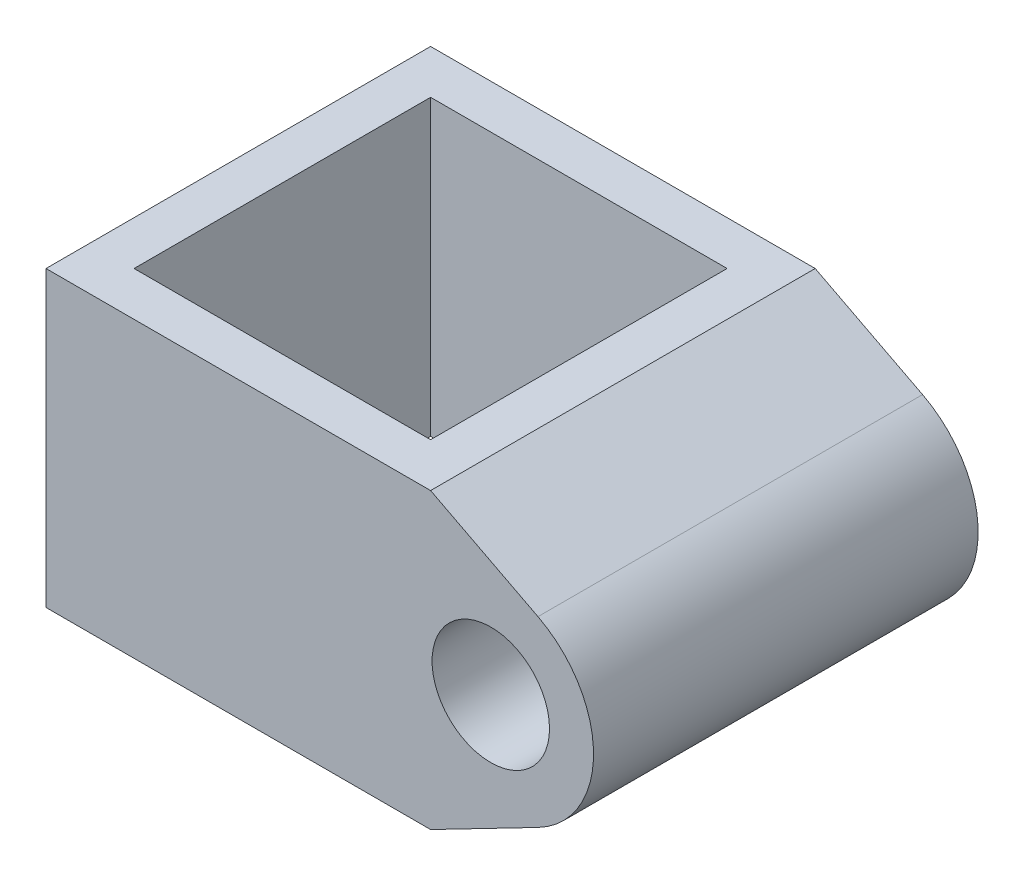
ISO-10303-21;
HEADER;
FILE_DESCRIPTION(('STEP AP214'),'2;1');
FILE_NAME('part.step','',(''),(''),'','','');
FILE_SCHEMA(('AUTOMOTIVE_DESIGN { 1 0 10303 214 1 1 1 1 }'));
ENDSEC;
DATA;
#1=APPLICATION_CONTEXT('core data for automotive mechanical design processes');
#2=APPLICATION_PROTOCOL_DEFINITION('international standard','automotive_design',2000,#1);
#3=PRODUCT_CONTEXT('',#1,'mechanical');
#4=PRODUCT('Part','Part','',(#3));
#5=PRODUCT_RELATED_PRODUCT_CATEGORY('part','',(#4));
#6=PRODUCT_DEFINITION_FORMATION('','',#4);
#7=PRODUCT_DEFINITION_CONTEXT('part definition',#1,'design');
#8=PRODUCT_DEFINITION('design','',#6,#7);
#9=PRODUCT_DEFINITION_SHAPE('','',#8);
#10=(LENGTH_UNIT() NAMED_UNIT(*) SI_UNIT(.MILLI.,.METRE.));
#11=(NAMED_UNIT(*) PLANE_ANGLE_UNIT() SI_UNIT($,.RADIAN.));
#12=(NAMED_UNIT(*) SI_UNIT($,.STERADIAN.) SOLID_ANGLE_UNIT());
#13=UNCERTAINTY_MEASURE_WITH_UNIT(LENGTH_MEASURE(1.E-05),#10,'distance_accuracy_value','');
#14=(GEOMETRIC_REPRESENTATION_CONTEXT(3) GLOBAL_UNCERTAINTY_ASSIGNED_CONTEXT((#13)) GLOBAL_UNIT_ASSIGNED_CONTEXT((#10,
#11,#12)) REPRESENTATION_CONTEXT('',''));
#15=CARTESIAN_POINT('',(0.,0.,0.));
#16=DIRECTION('',(0.,0.,1.));
#17=DIRECTION('',(1.,0.,0.));
#18=AXIS2_PLACEMENT_3D('',#15,#16,#17);
#19=CARTESIAN_POINT('',(0.,20.,0.));
#20=DIRECTION('',(0.,-1.,0.));
#21=DIRECTION('',(0.,0.,-1.));
#22=AXIS2_PLACEMENT_3D('',#19,#20,#21);
#23=PLANE('',#22);
#24=DIRECTION('',(0.,0.,1.));
#25=VECTOR('',#24,1.);
#26=CARTESIAN_POINT('',(-3.,20.,3.));
#27=LINE('',#26,#25);
#28=CARTESIAN_POINT('',(-3.,20.,-23.2));
#29=VERTEX_POINT('',#28);
#30=CARTESIAN_POINT('',(-3.,20.,3.));
#31=VERTEX_POINT('',#30);
#32=EDGE_CURVE('E209',#29,#31,#27,.T.);
#33=ORIENTED_EDGE('',*,*,#32,.T.);
#34=DIRECTION('',(1.,0.,0.));
#35=VECTOR('',#34,1.);
#36=CARTESIAN_POINT('',(-3.,20.,3.));
#37=LINE('',#36,#35);
#38=CARTESIAN_POINT('',(23.2,20.,3.));
#39=VERTEX_POINT('',#38);
#40=EDGE_CURVE('E213',#31,#39,#37,.T.);
#41=ORIENTED_EDGE('',*,*,#40,.T.);
#42=DIRECTION('',(0.,0.,-1.));
#43=VECTOR('',#42,1.);
#44=CARTESIAN_POINT('',(23.2,20.,3.));
#45=LINE('',#44,#43);
#46=CARTESIAN_POINT('',(23.2,20.,-23.2));
#47=VERTEX_POINT('',#46);
#48=EDGE_CURVE('E146',#39,#47,#45,.T.);
#49=ORIENTED_EDGE('',*,*,#48,.T.);
#50=DIRECTION('',(-1.,0.,0.));
#51=VECTOR('',#50,1.);
#52=CARTESIAN_POINT('',(-3.,20.,-23.2));
#53=LINE('',#52,#51);
#54=EDGE_CURVE('E219',#47,#29,#53,.T.);
#55=ORIENTED_EDGE('',*,*,#54,.T.);
#56=EDGE_LOOP('',(#33,#41,#49,#55));
#57=FACE_BOUND('',#56,.T.);
#58=DIRECTION('',(0.,0.,1.));
#59=VECTOR('',#58,1.);
#60=CARTESIAN_POINT('',(0.,20.,0.));
#61=LINE('',#60,#59);
#62=CARTESIAN_POINT('',(0.,20.,-20.2));
#63=VERTEX_POINT('',#62);
#64=CARTESIAN_POINT('',(0.,20.,0.));
#65=VERTEX_POINT('',#64);
#66=EDGE_CURVE('E170',#63,#65,#61,.T.);
#67=ORIENTED_EDGE('',*,*,#66,.F.);
#68=DIRECTION('',(-1.,0.,0.));
#69=VECTOR('',#68,1.);
#70=CARTESIAN_POINT('',(0.,20.,-20.2));
#71=LINE('',#70,#69);
#72=CARTESIAN_POINT('',(20.2,20.,-20.2));
#73=VERTEX_POINT('',#72);
#74=EDGE_CURVE('E180',#73,#63,#71,.T.);
#75=ORIENTED_EDGE('',*,*,#74,.F.);
#76=DIRECTION('',(0.,0.,-1.));
#77=VECTOR('',#76,1.);
#78=CARTESIAN_POINT('',(20.2,20.,0.));
#79=LINE('',#78,#77);
#80=CARTESIAN_POINT('',(20.2,20.,0.));
#81=VERTEX_POINT('',#80);
#82=EDGE_CURVE('E177',#81,#73,#79,.T.);
#83=ORIENTED_EDGE('',*,*,#82,.F.);
#84=DIRECTION('',(1.,0.,0.));
#85=VECTOR('',#84,1.);
#86=CARTESIAN_POINT('',(0.,20.,0.));
#87=LINE('',#86,#85);
#88=EDGE_CURVE('E173',#65,#81,#87,.T.);
#89=ORIENTED_EDGE('',*,*,#88,.F.);
#90=EDGE_LOOP('',(#67,#75,#83,#89));
#91=FACE_BOUND('',#90,.T.);
#92=ADVANCED_FACE('F47',(#57,#91),#23,.F.);
#93=CARTESIAN_POINT('',(0.,0.,0.));
#94=DIRECTION('',(0.,-1.,0.));
#95=DIRECTION('',(0.,0.,-1.));
#96=AXIS2_PLACEMENT_3D('',#93,#94,#95);
#97=PLANE('',#96);
#98=DIRECTION('',(0.,0.,1.));
#99=VECTOR('',#98,1.);
#100=CARTESIAN_POINT('',(-3.,0.,3.));
#101=LINE('',#100,#99);
#102=CARTESIAN_POINT('',(-3.,0.,-23.2));
#103=VERTEX_POINT('',#102);
#104=CARTESIAN_POINT('',(-3.,0.,3.));
#105=VERTEX_POINT('',#104);
#106=EDGE_CURVE('E208',#103,#105,#101,.T.);
#107=ORIENTED_EDGE('',*,*,#106,.F.);
#108=DIRECTION('',(-1.,0.,0.));
#109=VECTOR('',#108,1.);
#110=CARTESIAN_POINT('',(-3.,0.,-23.2));
#111=LINE('',#110,#109);
#112=CARTESIAN_POINT('',(23.2,0.,-23.2));
#113=VERTEX_POINT('',#112);
#114=EDGE_CURVE('E214',#113,#103,#111,.T.);
#115=ORIENTED_EDGE('',*,*,#114,.F.);
#116=DIRECTION('',(0.,0.,-1.));
#117=VECTOR('',#116,1.);
#118=CARTESIAN_POINT('',(23.2,0.,3.));
#119=LINE('',#118,#117);
#120=CARTESIAN_POINT('',(23.2,0.,3.));
#121=VERTEX_POINT('',#120);
#122=EDGE_CURVE('E228',#121,#113,#119,.T.);
#123=ORIENTED_EDGE('',*,*,#122,.F.);
#124=DIRECTION('',(1.,0.,0.));
#125=VECTOR('',#124,1.);
#126=CARTESIAN_POINT('',(-3.,0.,3.));
#127=LINE('',#126,#125);
#128=EDGE_CURVE('E225',#105,#121,#127,.T.);
#129=ORIENTED_EDGE('',*,*,#128,.F.);
#130=EDGE_LOOP('',(#107,#115,#123,#129));
#131=FACE_BOUND('',#130,.T.);
#132=DIRECTION('',(-1.,0.,0.));
#133=VECTOR('',#132,1.);
#134=CARTESIAN_POINT('',(0.,0.,-20.2));
#135=LINE('',#134,#133);
#136=CARTESIAN_POINT('',(20.2,0.,-20.2));
#137=VERTEX_POINT('',#136);
#138=CARTESIAN_POINT('',(0.,0.,-20.2));
#139=VERTEX_POINT('',#138);
#140=EDGE_CURVE('E174',#137,#139,#135,.T.);
#141=ORIENTED_EDGE('',*,*,#140,.T.);
#142=DIRECTION('',(0.,0.,1.));
#143=VECTOR('',#142,1.);
#144=CARTESIAN_POINT('',(0.,0.,0.));
#145=LINE('',#144,#143);
#146=CARTESIAN_POINT('',(0.,0.,0.));
#147=VERTEX_POINT('',#146);
#148=EDGE_CURVE('E71',#139,#147,#145,.T.);
#149=ORIENTED_EDGE('',*,*,#148,.T.);
#150=DIRECTION('',(1.,0.,0.));
#151=VECTOR('',#150,1.);
#152=CARTESIAN_POINT('',(0.,0.,0.));
#153=LINE('',#152,#151);
#154=CARTESIAN_POINT('',(20.2,0.,0.));
#155=VERTEX_POINT('',#154);
#156=EDGE_CURVE('E186',#147,#155,#153,.T.);
#157=ORIENTED_EDGE('',*,*,#156,.T.);
#158=DIRECTION('',(0.,0.,-1.));
#159=VECTOR('',#158,1.);
#160=CARTESIAN_POINT('',(20.2,0.,0.));
#161=LINE('',#160,#159);
#162=EDGE_CURVE('E191',#155,#137,#161,.T.);
#163=ORIENTED_EDGE('',*,*,#162,.T.);
#164=EDGE_LOOP('',(#141,#149,#157,#163));
#165=FACE_BOUND('',#164,.T.);
#166=ADVANCED_FACE('F243',(#131,#165),#97,.T.);
#167=CARTESIAN_POINT('',(-3.,20.,3.));
#168=DIRECTION('',(1.,0.,0.));
#169=DIRECTION('',(0.,0.,-1.));
#170=AXIS2_PLACEMENT_3D('',#167,#168,#169);
#171=PLANE('',#170);
#172=ORIENTED_EDGE('',*,*,#106,.T.);
#173=DIRECTION('',(0.,-1.,0.));
#174=VECTOR('',#173,1.);
#175=CARTESIAN_POINT('',(-3.,20.,3.));
#176=LINE('',#175,#174);
#177=EDGE_CURVE('E11',#31,#105,#176,.T.);
#178=ORIENTED_EDGE('',*,*,#177,.F.);
#179=ORIENTED_EDGE('',*,*,#32,.F.);
#180=DIRECTION('',(0.,-1.,0.));
#181=VECTOR('',#180,1.);
#182=CARTESIAN_POINT('',(-3.,20.,-23.2));
#183=LINE('',#182,#181);
#184=EDGE_CURVE('E56',#29,#103,#183,.T.);
#185=ORIENTED_EDGE('',*,*,#184,.T.);
#186=EDGE_LOOP('',(#172,#178,#179,#185));
#187=FACE_BOUND('',#186,.T.);
#188=ADVANCED_FACE('F49',(#187),#171,.F.);
#189=CARTESIAN_POINT('',(-3.,20.,3.));
#190=DIRECTION('',(0.,0.,-1.));
#191=DIRECTION('',(-1.,0.,0.));
#192=AXIS2_PLACEMENT_3D('',#189,#190,#191);
#193=PLANE('',#192);
#194=ORIENTED_EDGE('',*,*,#128,.T.);
#195=DIRECTION('',(0.888298940815905,0.459265709307087,0.));
#196=VECTOR('',#195,1.);
#197=CARTESIAN_POINT('',(4.89345980849192,-9.46479364062877,3.));
#198=LINE('',#197,#196);
#199=CARTESIAN_POINT('',(30.5148599651496,3.78190741428866,3.));
#200=VERTEX_POINT('',#199);
#201=EDGE_CURVE('E140',#121,#200,#198,.T.);
#202=ORIENTED_EDGE('',*,*,#201,.T.);
#203=CARTESIAN_POINT('',(27.3,10.,3.));
#204=DIRECTION('',(0.,0.,1.));
#205=DIRECTION('',(1.,0.,0.));
#206=AXIS2_PLACEMENT_3D('',#203,#204,#205);
#207=CIRCLE('',#206,7.00000000000001);
#208=CARTESIAN_POINT('',(30.5148599651496,16.2180925857113,3.));
#209=VERTEX_POINT('',#208);
#210=EDGE_CURVE('E133',#200,#209,#207,.T.);
#211=ORIENTED_EDGE('',*,*,#210,.T.);
#212=DIRECTION('',(0.888298940815905,-0.459265709307087,0.));
#213=VECTOR('',#212,1.);
#214=CARTESIAN_POINT('',(13.0527646711029,25.2462938057219,3.));
#215=LINE('',#214,#213);
#216=EDGE_CURVE('E144',#39,#209,#215,.T.);
#217=ORIENTED_EDGE('',*,*,#216,.F.);
#218=ORIENTED_EDGE('',*,*,#40,.F.);
#219=ORIENTED_EDGE('',*,*,#177,.T.);
#220=EDGE_LOOP('',(#194,#202,#211,#217,#218,#219));
#221=FACE_BOUND('',#220,.T.);
#222=CARTESIAN_POINT('',(27.3,10.,3.));
#223=DIRECTION('',(0.,0.,1.));
#224=DIRECTION('',(1.,0.,0.));
#225=AXIS2_PLACEMENT_3D('',#222,#223,#224);
#226=CIRCLE('',#225,4.00000000000001);
#227=CARTESIAN_POINT('',(31.3,10.,3.));
#228=VERTEX_POINT('',#227);
#229=EDGE_CURVE('E155',#228,#228,#226,.T.);
#230=ORIENTED_EDGE('',*,*,#229,.F.);
#231=EDGE_LOOP('',(#230));
#232=FACE_BOUND('',#231,.T.);
#233=ADVANCED_FACE('F151',(#221,#232),#193,.F.);
#234=CARTESIAN_POINT('',(-3.,20.,-23.2));
#235=DIRECTION('',(0.,0.,1.));
#236=DIRECTION('',(1.,0.,0.));
#237=AXIS2_PLACEMENT_3D('',#234,#235,#236);
#238=PLANE('',#237);
#239=ORIENTED_EDGE('',*,*,#114,.T.);
#240=ORIENTED_EDGE('',*,*,#184,.F.);
#241=ORIENTED_EDGE('',*,*,#54,.F.);
#242=DIRECTION('',(-0.888298940815905,0.459265709307087,0.));
#243=VECTOR('',#242,1.);
#244=CARTESIAN_POINT('',(13.0527646711029,25.2462938057219,-23.2));
#245=LINE('',#244,#243);
#246=CARTESIAN_POINT('',(30.5148599651496,16.2180925857113,-23.2));
#247=VERTEX_POINT('',#246);
#248=EDGE_CURVE('E165',#247,#47,#245,.T.);
#249=ORIENTED_EDGE('',*,*,#248,.F.);
#250=CARTESIAN_POINT('',(27.3,10.,-23.2));
#251=DIRECTION('',(0.,0.,1.));
#252=DIRECTION('',(1.,0.,0.));
#253=AXIS2_PLACEMENT_3D('',#250,#251,#252);
#254=CIRCLE('',#253,7.00000000000001);
#255=CARTESIAN_POINT('',(30.5148599651496,3.78190741428867,-23.2));
#256=VERTEX_POINT('',#255);
#257=EDGE_CURVE('E135',#247,#256,#254,.F.);
#258=ORIENTED_EDGE('',*,*,#257,.T.);
#259=DIRECTION('',(-0.888298940815905,-0.459265709307087,0.));
#260=VECTOR('',#259,1.);
#261=CARTESIAN_POINT('',(4.89345980849192,-9.46479364062877,-23.2));
#262=LINE('',#261,#260);
#263=EDGE_CURVE('E169',#256,#113,#262,.T.);
#264=ORIENTED_EDGE('',*,*,#263,.T.);
#265=EDGE_LOOP('',(#239,#240,#241,#249,#258,#264));
#266=FACE_BOUND('',#265,.T.);
#267=CARTESIAN_POINT('',(27.3,10.,-23.2));
#268=DIRECTION('',(0.,0.,1.));
#269=DIRECTION('',(1.,0.,0.));
#270=AXIS2_PLACEMENT_3D('',#267,#268,#269);
#271=CIRCLE('',#270,4.00000000000001);
#272=CARTESIAN_POINT('',(31.3,10.,-23.2));
#273=VERTEX_POINT('',#272);
#274=EDGE_CURVE('E187',#273,#273,#271,.F.);
#275=ORIENTED_EDGE('',*,*,#274,.F.);
#276=EDGE_LOOP('',(#275));
#277=FACE_BOUND('',#276,.T.);
#278=ADVANCED_FACE('F248',(#266,#277),#238,.F.);
#279=CARTESIAN_POINT('',(0.,20.,0.));
#280=DIRECTION('',(1.,0.,0.));
#281=DIRECTION('',(0.,0.,-1.));
#282=AXIS2_PLACEMENT_3D('',#279,#280,#281);
#283=PLANE('',#282);
#284=ORIENTED_EDGE('',*,*,#148,.F.);
#285=DIRECTION('',(0.,-1.,0.));
#286=VECTOR('',#285,1.);
#287=CARTESIAN_POINT('',(0.,20.,-20.2));
#288=LINE('',#287,#286);
#289=EDGE_CURVE('E183',#63,#139,#288,.T.);
#290=ORIENTED_EDGE('',*,*,#289,.F.);
#291=ORIENTED_EDGE('',*,*,#66,.T.);
#292=DIRECTION('',(0.,-1.,0.));
#293=VECTOR('',#292,1.);
#294=CARTESIAN_POINT('',(0.,20.,0.));
#295=LINE('',#294,#293);
#296=EDGE_CURVE('E205',#65,#147,#295,.T.);
#297=ORIENTED_EDGE('',*,*,#296,.T.);
#298=EDGE_LOOP('',(#284,#290,#291,#297));
#299=FACE_BOUND('',#298,.T.);
#300=ADVANCED_FACE('F264',(#299),#283,.T.);
#301=CARTESIAN_POINT('',(0.,20.,0.));
#302=DIRECTION('',(0.,0.,-1.));
#303=DIRECTION('',(-1.,0.,0.));
#304=AXIS2_PLACEMENT_3D('',#301,#302,#303);
#305=PLANE('',#304);
#306=ORIENTED_EDGE('',*,*,#156,.F.);
#307=ORIENTED_EDGE('',*,*,#296,.F.);
#308=ORIENTED_EDGE('',*,*,#88,.T.);
#309=DIRECTION('',(0.,-1.,0.));
#310=VECTOR('',#309,1.);
#311=CARTESIAN_POINT('',(20.2,20.,0.));
#312=LINE('',#311,#310);
#313=EDGE_CURVE('E202',#81,#155,#312,.T.);
#314=ORIENTED_EDGE('',*,*,#313,.T.);
#315=EDGE_LOOP('',(#306,#307,#308,#314));
#316=FACE_BOUND('',#315,.T.);
#317=ADVANCED_FACE('F271',(#316),#305,.T.);
#318=CARTESIAN_POINT('',(20.2,20.,0.));
#319=DIRECTION('',(-1.,0.,0.));
#320=DIRECTION('',(0.,0.,1.));
#321=AXIS2_PLACEMENT_3D('',#318,#319,#320);
#322=PLANE('',#321);
#323=ORIENTED_EDGE('',*,*,#162,.F.);
#324=ORIENTED_EDGE('',*,*,#313,.F.);
#325=ORIENTED_EDGE('',*,*,#82,.T.);
#326=DIRECTION('',(0.,-1.,0.));
#327=VECTOR('',#326,1.);
#328=CARTESIAN_POINT('',(20.2,20.,-20.2));
#329=LINE('',#328,#327);
#330=EDGE_CURVE('E63',#73,#137,#329,.T.);
#331=ORIENTED_EDGE('',*,*,#330,.T.);
#332=EDGE_LOOP('',(#323,#324,#325,#331));
#333=FACE_BOUND('',#332,.T.);
#334=ADVANCED_FACE('F283',(#333),#322,.T.);
#335=CARTESIAN_POINT('',(0.,20.,-20.2));
#336=DIRECTION('',(0.,0.,1.));
#337=DIRECTION('',(1.,0.,0.));
#338=AXIS2_PLACEMENT_3D('',#335,#336,#337);
#339=PLANE('',#338);
#340=ORIENTED_EDGE('',*,*,#140,.F.);
#341=ORIENTED_EDGE('',*,*,#330,.F.);
#342=ORIENTED_EDGE('',*,*,#74,.T.);
#343=ORIENTED_EDGE('',*,*,#289,.T.);
#344=EDGE_LOOP('',(#340,#341,#342,#343));
#345=FACE_BOUND('',#344,.T.);
#346=ADVANCED_FACE('F287',(#345),#339,.T.);
#347=CARTESIAN_POINT('',(27.3,10.,-46.0737841206915));
#348=DIRECTION('',(0.,0.,1.));
#349=DIRECTION('',(1.,0.,0.));
#350=AXIS2_PLACEMENT_3D('',#347,#348,#349);
#351=CYLINDRICAL_SURFACE('',#350,4.00000000000001);
#352=ORIENTED_EDGE('',*,*,#274,.T.);
#353=EDGE_LOOP('',(#352));
#354=FACE_BOUND('',#353,.T.);
#355=ORIENTED_EDGE('',*,*,#229,.T.);
#356=EDGE_LOOP('',(#355));
#357=FACE_BOUND('',#356,.T.);
#358=ADVANCED_FACE('F261',(#354,#357),#351,.F.);
#359=CARTESIAN_POINT('',(13.0527646711029,25.2462938057219,-46.0737841206915));
#360=DIRECTION('',(-0.459265709307087,-0.888298940815905,0.));
#361=DIRECTION('',(0.888298940815905,-0.459265709307087,0.));
#362=AXIS2_PLACEMENT_3D('',#359,#360,#361);
#363=PLANE('',#362);
#364=DIRECTION('',(0.,0.,1.));
#365=VECTOR('',#364,1.);
#366=CARTESIAN_POINT('',(30.5148599651496,16.2180925857113,-46.0737841206915));
#367=LINE('',#366,#365);
#368=EDGE_CURVE('E128',#247,#209,#367,.T.);
#369=ORIENTED_EDGE('',*,*,#368,.F.);
#370=ORIENTED_EDGE('',*,*,#248,.T.);
#371=ORIENTED_EDGE('',*,*,#48,.F.);
#372=ORIENTED_EDGE('',*,*,#216,.T.);
#373=EDGE_LOOP('',(#369,#370,#371,#372));
#374=FACE_BOUND('',#373,.T.);
#375=ADVANCED_FACE('F145',(#374),#363,.F.);
#376=CARTESIAN_POINT('',(4.89345980849192,-9.46479364062877,-46.0737841206915));
#377=DIRECTION('',(0.459265709307087,-0.888298940815905,0.));
#378=DIRECTION('',(0.888298940815905,0.459265709307087,0.));
#379=AXIS2_PLACEMENT_3D('',#376,#377,#378);
#380=PLANE('',#379);
#381=ORIENTED_EDGE('',*,*,#263,.F.);
#382=DIRECTION('',(0.,0.,1.));
#383=VECTOR('',#382,1.);
#384=CARTESIAN_POINT('',(30.5148599651496,3.78190741428866,-46.0737841206915));
#385=LINE('',#384,#383);
#386=EDGE_CURVE('E139',#256,#200,#385,.T.);
#387=ORIENTED_EDGE('',*,*,#386,.T.);
#388=ORIENTED_EDGE('',*,*,#201,.F.);
#389=ORIENTED_EDGE('',*,*,#122,.T.);
#390=EDGE_LOOP('',(#381,#387,#388,#389));
#391=FACE_BOUND('',#390,.T.);
#392=ADVANCED_FACE('F254',(#391),#380,.T.);
#393=CARTESIAN_POINT('',(27.3,10.,-46.0737841206915));
#394=DIRECTION('',(0.,0.,1.));
#395=DIRECTION('',(1.,0.,0.));
#396=AXIS2_PLACEMENT_3D('',#393,#394,#395);
#397=CYLINDRICAL_SURFACE('',#396,7.00000000000001);
#398=ORIENTED_EDGE('',*,*,#257,.F.);
#399=ORIENTED_EDGE('',*,*,#368,.T.);
#400=ORIENTED_EDGE('',*,*,#210,.F.);
#401=ORIENTED_EDGE('',*,*,#386,.F.);
#402=EDGE_LOOP('',(#398,#399,#400,#401));
#403=FACE_BOUND('',#402,.T.);
#404=ADVANCED_FACE('F130',(#403),#397,.T.);
#405=CLOSED_SHELL('',(#92,#166,#188,#233,#278,#300,#317,#334,#346,#358,#375,#392,#404));
#406=MANIFOLD_SOLID_BREP('B2',#405);
#407=ADVANCED_BREP_SHAPE_REPRESENTATION('',(#18,#406),#14);
#408=SHAPE_DEFINITION_REPRESENTATION(#9,#407);
ENDSEC;
END-ISO-10303-21;
